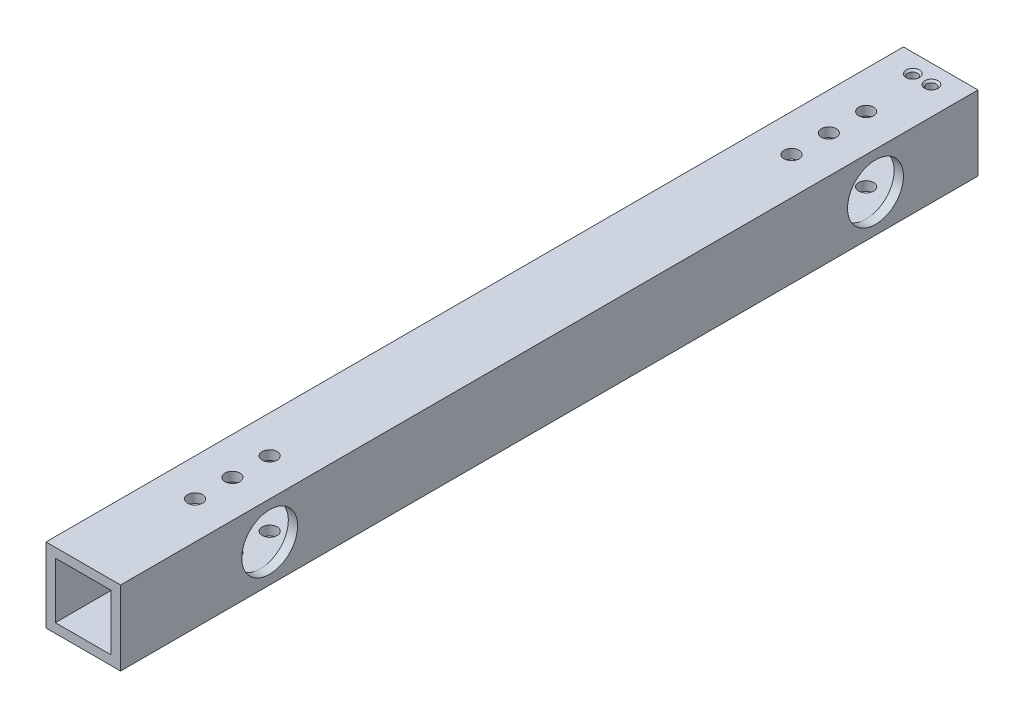
ISO-10303-21;
HEADER;
FILE_DESCRIPTION(('STEP AP214'),'2;1');
FILE_NAME('part.step','',(''),(''),'','','');
FILE_SCHEMA(('AUTOMOTIVE_DESIGN { 1 0 10303 214 1 1 1 1 }'));
ENDSEC;
DATA;
#1=APPLICATION_CONTEXT('core data for automotive mechanical design processes');
#2=APPLICATION_PROTOCOL_DEFINITION('international standard','automotive_design',2000,#1);
#3=PRODUCT_CONTEXT('',#1,'mechanical');
#4=PRODUCT('Part','Part','',(#3));
#5=PRODUCT_RELATED_PRODUCT_CATEGORY('part','',(#4));
#6=PRODUCT_DEFINITION_FORMATION('','',#4);
#7=PRODUCT_DEFINITION_CONTEXT('part definition',#1,'design');
#8=PRODUCT_DEFINITION('design','',#6,#7);
#9=PRODUCT_DEFINITION_SHAPE('','',#8);
#10=(LENGTH_UNIT() NAMED_UNIT(*) SI_UNIT(.MILLI.,.METRE.));
#11=(NAMED_UNIT(*) PLANE_ANGLE_UNIT() SI_UNIT($,.RADIAN.));
#12=(NAMED_UNIT(*) SI_UNIT($,.STERADIAN.) SOLID_ANGLE_UNIT());
#13=UNCERTAINTY_MEASURE_WITH_UNIT(LENGTH_MEASURE(1.E-05),#10,'distance_accuracy_value','');
#14=(GEOMETRIC_REPRESENTATION_CONTEXT(3) GLOBAL_UNCERTAINTY_ASSIGNED_CONTEXT((#13)) GLOBAL_UNIT_ASSIGNED_CONTEXT((#10,
#11,#12)) REPRESENTATION_CONTEXT('',''));
#15=CARTESIAN_POINT('',(0.,0.,0.));
#16=DIRECTION('',(0.,0.,1.));
#17=DIRECTION('',(1.,0.,0.));
#18=AXIS2_PLACEMENT_3D('',#15,#16,#17);
#19=CARTESIAN_POINT('',(0.,0.,292.1));
#20=DIRECTION('',(0.,1.,0.));
#21=DIRECTION('',(-1.,0.,0.));
#22=AXIS2_PLACEMENT_3D('',#19,#20,#21);
#23=PLANE('',#22);
#24=CARTESIAN_POINT('',(-9.525,0.,6.35));
#25=DIRECTION('',(0.,1.,0.));
#26=DIRECTION('',(-1.,0.,0.));
#27=AXIS2_PLACEMENT_3D('',#24,#25,#26);
#28=CIRCLE('',#27,1.63195);
#29=CARTESIAN_POINT('',(-11.15695,0.,6.35));
#30=VERTEX_POINT('',#29);
#31=EDGE_CURVE('E441',#30,#30,#28,.F.);
#32=ORIENTED_EDGE('',*,*,#31,.F.);
#33=EDGE_LOOP('',(#32));
#34=FACE_BOUND('',#33,.T.);
#35=CARTESIAN_POINT('',(-15.875,0.,6.35));
#36=DIRECTION('',(0.,1.,0.));
#37=DIRECTION('',(-1.,0.,0.));
#38=AXIS2_PLACEMENT_3D('',#35,#36,#37);
#39=CIRCLE('',#38,1.63195);
#40=CARTESIAN_POINT('',(-17.50695,0.,6.35));
#41=VERTEX_POINT('',#40);
#42=EDGE_CURVE('E424',#41,#41,#39,.F.);
#43=ORIENTED_EDGE('',*,*,#42,.F.);
#44=EDGE_LOOP('',(#43));
#45=FACE_BOUND('',#44,.T.);
#46=CARTESIAN_POINT('',(-12.7,0.,241.3));
#47=DIRECTION('',(0.,1.,0.));
#48=DIRECTION('',(-1.,0.,0.));
#49=AXIS2_PLACEMENT_3D('',#46,#47,#48);
#50=CIRCLE('',#49,2.55269999999999);
#51=CARTESIAN_POINT('',(-15.2527,0.,241.3));
#52=VERTEX_POINT('',#51);
#53=EDGE_CURVE('E170',#52,#52,#50,.F.);
#54=ORIENTED_EDGE('',*,*,#53,.F.);
#55=EDGE_LOOP('',(#54));
#56=FACE_BOUND('',#55,.T.);
#57=CARTESIAN_POINT('',(-12.7,0.,228.6));
#58=DIRECTION('',(0.,1.,0.));
#59=DIRECTION('',(-1.,0.,0.));
#60=AXIS2_PLACEMENT_3D('',#57,#58,#59);
#61=CIRCLE('',#60,2.55269999999999);
#62=CARTESIAN_POINT('',(-15.2527,0.,228.6));
#63=VERTEX_POINT('',#62);
#64=EDGE_CURVE('E367',#63,#63,#61,.F.);
#65=ORIENTED_EDGE('',*,*,#64,.F.);
#66=EDGE_LOOP('',(#65));
#67=FACE_BOUND('',#66,.T.);
#68=DIRECTION('',(1.,0.,0.));
#69=VECTOR('',#68,1.);
#70=CARTESIAN_POINT('',(0.,0.,0.));
#71=LINE('',#70,#69);
#72=CARTESIAN_POINT('',(-25.4,0.,0.));
#73=VERTEX_POINT('',#72);
#74=CARTESIAN_POINT('',(0.,0.,0.));
#75=VERTEX_POINT('',#74);
#76=EDGE_CURVE('E267',#73,#75,#71,.T.);
#77=ORIENTED_EDGE('',*,*,#76,.T.);
#78=DIRECTION('',(0.,0.,-1.));
#79=VECTOR('',#78,1.);
#80=CARTESIAN_POINT('',(0.,0.,292.1));
#81=LINE('',#80,#79);
#82=CARTESIAN_POINT('',(0.,0.,292.1));
#83=VERTEX_POINT('',#82);
#84=EDGE_CURVE('E276',#83,#75,#81,.T.);
#85=ORIENTED_EDGE('',*,*,#84,.F.);
#86=DIRECTION('',(1.,0.,0.));
#87=VECTOR('',#86,1.);
#88=CARTESIAN_POINT('',(0.,0.,292.1));
#89=LINE('',#88,#87);
#90=CARTESIAN_POINT('',(-25.4,0.,292.1));
#91=VERTEX_POINT('',#90);
#92=EDGE_CURVE('E274',#91,#83,#89,.T.);
#93=ORIENTED_EDGE('',*,*,#92,.F.);
#94=DIRECTION('',(0.,0.,-1.));
#95=VECTOR('',#94,1.);
#96=CARTESIAN_POINT('',(-25.4,0.,292.1));
#97=LINE('',#96,#95);
#98=EDGE_CURVE('E260',#91,#73,#97,.T.);
#99=ORIENTED_EDGE('',*,*,#98,.T.);
#100=EDGE_LOOP('',(#77,#85,#93,#99));
#101=FACE_BOUND('',#100,.T.);
#102=CARTESIAN_POINT('',(-12.7,0.,254.));
#103=DIRECTION('',(0.,1.,0.));
#104=DIRECTION('',(-1.,0.,0.));
#105=AXIS2_PLACEMENT_3D('',#102,#103,#104);
#106=CIRCLE('',#105,2.55269999999999);
#107=CARTESIAN_POINT('',(-15.2527,0.,254.));
#108=VERTEX_POINT('',#107);
#109=EDGE_CURVE('E186',#108,#108,#106,.F.);
#110=ORIENTED_EDGE('',*,*,#109,.F.);
#111=EDGE_LOOP('',(#110));
#112=FACE_BOUND('',#111,.T.);
#113=CARTESIAN_POINT('',(-12.7,0.,25.4));
#114=DIRECTION('',(0.,1.,0.));
#115=DIRECTION('',(-1.,0.,0.));
#116=AXIS2_PLACEMENT_3D('',#113,#114,#115);
#117=CIRCLE('',#116,2.5527);
#118=CARTESIAN_POINT('',(-15.2527,0.,25.4));
#119=VERTEX_POINT('',#118);
#120=EDGE_CURVE('E458',#119,#119,#117,.F.);
#121=ORIENTED_EDGE('',*,*,#120,.F.);
#122=EDGE_LOOP('',(#121));
#123=FACE_BOUND('',#122,.T.);
#124=CARTESIAN_POINT('',(-12.7,0.,38.1));
#125=DIRECTION('',(0.,1.,0.));
#126=DIRECTION('',(-1.,0.,0.));
#127=AXIS2_PLACEMENT_3D('',#124,#125,#126);
#128=CIRCLE('',#127,2.5527);
#129=CARTESIAN_POINT('',(-15.2527,0.,38.1));
#130=VERTEX_POINT('',#129);
#131=EDGE_CURVE('E470',#130,#130,#128,.F.);
#132=ORIENTED_EDGE('',*,*,#131,.F.);
#133=EDGE_LOOP('',(#132));
#134=FACE_BOUND('',#133,.T.);
#135=CARTESIAN_POINT('',(-12.7,0.,50.8));
#136=DIRECTION('',(0.,1.,0.));
#137=DIRECTION('',(-1.,0.,0.));
#138=AXIS2_PLACEMENT_3D('',#135,#136,#137);
#139=CIRCLE('',#138,2.5527);
#140=CARTESIAN_POINT('',(-15.2527,0.,50.8));
#141=VERTEX_POINT('',#140);
#142=EDGE_CURVE('E482',#141,#141,#139,.F.);
#143=ORIENTED_EDGE('',*,*,#142,.F.);
#144=EDGE_LOOP('',(#143));
#145=FACE_BOUND('',#144,.T.);
#146=ADVANCED_FACE('F38',(#34,#45,#56,#67,#101,#112,#123,#134,#145),#23,.F.);
#147=CARTESIAN_POINT('',(0.,25.4,292.1));
#148=DIRECTION('',(0.,-1.,0.));
#149=DIRECTION('',(1.,0.,0.));
#150=AXIS2_PLACEMENT_3D('',#147,#148,#149);
#151=PLANE('',#150);
#152=CARTESIAN_POINT('',(-12.7,25.4,50.8));
#153=DIRECTION('',(0.,1.,0.));
#154=DIRECTION('',(0.,0.,1.));
#155=AXIS2_PLACEMENT_3D('',#152,#153,#154);
#156=CIRCLE('',#155,2.5527);
#157=CARTESIAN_POINT('',(-12.7,25.4,53.3527));
#158=VERTEX_POINT('',#157);
#159=EDGE_CURVE('E483',#158,#158,#156,.T.);
#160=ORIENTED_EDGE('',*,*,#159,.F.);
#161=EDGE_LOOP('',(#160));
#162=FACE_BOUND('',#161,.T.);
#163=CARTESIAN_POINT('',(-12.7,25.4,25.4));
#164=DIRECTION('',(0.,1.,0.));
#165=DIRECTION('',(0.,0.,1.));
#166=AXIS2_PLACEMENT_3D('',#163,#164,#165);
#167=CIRCLE('',#166,2.5527);
#168=CARTESIAN_POINT('',(-12.7,25.4,27.9527));
#169=VERTEX_POINT('',#168);
#170=EDGE_CURVE('E454',#169,#169,#167,.T.);
#171=ORIENTED_EDGE('',*,*,#170,.F.);
#172=EDGE_LOOP('',(#171));
#173=FACE_BOUND('',#172,.T.);
#174=CARTESIAN_POINT('',(-9.525,25.4,6.35));
#175=DIRECTION('',(0.,1.,0.));
#176=DIRECTION('',(0.,0.,1.));
#177=AXIS2_PLACEMENT_3D('',#174,#175,#176);
#178=CIRCLE('',#177,2.26695);
#179=CARTESIAN_POINT('',(-9.525,25.4,8.61695));
#180=VERTEX_POINT('',#179);
#181=EDGE_CURVE('E442',#180,#180,#178,.T.);
#182=ORIENTED_EDGE('',*,*,#181,.F.);
#183=EDGE_LOOP('',(#182));
#184=FACE_BOUND('',#183,.T.);
#185=CARTESIAN_POINT('',(-15.875,25.4,6.35));
#186=DIRECTION('',(0.,1.,0.));
#187=DIRECTION('',(0.,0.,1.));
#188=AXIS2_PLACEMENT_3D('',#185,#186,#187);
#189=CIRCLE('',#188,2.26695);
#190=CARTESIAN_POINT('',(-15.875,25.4,8.61695));
#191=VERTEX_POINT('',#190);
#192=EDGE_CURVE('E425',#191,#191,#189,.T.);
#193=ORIENTED_EDGE('',*,*,#192,.F.);
#194=EDGE_LOOP('',(#193));
#195=FACE_BOUND('',#194,.T.);
#196=CARTESIAN_POINT('',(-12.7,25.4,254.));
#197=DIRECTION('',(0.,1.,0.));
#198=DIRECTION('',(0.,0.,1.));
#199=AXIS2_PLACEMENT_3D('',#196,#197,#198);
#200=CIRCLE('',#199,2.55269999999999);
#201=CARTESIAN_POINT('',(-12.7,25.4,256.5527));
#202=VERTEX_POINT('',#201);
#203=EDGE_CURVE('E380',#202,#202,#200,.T.);
#204=ORIENTED_EDGE('',*,*,#203,.F.);
#205=EDGE_LOOP('',(#204));
#206=FACE_BOUND('',#205,.T.);
#207=CARTESIAN_POINT('',(-12.7,25.4,241.3));
#208=DIRECTION('',(0.,1.,0.));
#209=DIRECTION('',(0.,0.,1.));
#210=AXIS2_PLACEMENT_3D('',#207,#208,#209);
#211=CIRCLE('',#210,2.55269999999999);
#212=CARTESIAN_POINT('',(-12.7,25.4,243.8527));
#213=VERTEX_POINT('',#212);
#214=EDGE_CURVE('E176',#213,#213,#211,.T.);
#215=ORIENTED_EDGE('',*,*,#214,.F.);
#216=EDGE_LOOP('',(#215));
#217=FACE_BOUND('',#216,.T.);
#218=CARTESIAN_POINT('',(-12.7,25.4,228.6));
#219=DIRECTION('',(0.,1.,0.));
#220=DIRECTION('',(0.,0.,1.));
#221=AXIS2_PLACEMENT_3D('',#218,#219,#220);
#222=CIRCLE('',#221,2.55269999999999);
#223=CARTESIAN_POINT('',(-12.7,25.4,231.1527));
#224=VERTEX_POINT('',#223);
#225=EDGE_CURVE('E363',#224,#224,#222,.T.);
#226=ORIENTED_EDGE('',*,*,#225,.F.);
#227=EDGE_LOOP('',(#226));
#228=FACE_BOUND('',#227,.T.);
#229=DIRECTION('',(-1.,0.,0.));
#230=VECTOR('',#229,1.);
#231=CARTESIAN_POINT('',(0.,25.4,0.));
#232=LINE('',#231,#230);
#233=CARTESIAN_POINT('',(0.,25.4,0.));
#234=VERTEX_POINT('',#233);
#235=CARTESIAN_POINT('',(-25.4,25.4,0.));
#236=VERTEX_POINT('',#235);
#237=EDGE_CURVE('E268',#234,#236,#232,.T.);
#238=ORIENTED_EDGE('',*,*,#237,.T.);
#239=DIRECTION('',(0.,0.,-1.));
#240=VECTOR('',#239,1.);
#241=CARTESIAN_POINT('',(-25.4,25.4,292.1));
#242=LINE('',#241,#240);
#243=CARTESIAN_POINT('',(-25.4,25.4,292.1));
#244=VERTEX_POINT('',#243);
#245=EDGE_CURVE('E263',#244,#236,#242,.T.);
#246=ORIENTED_EDGE('',*,*,#245,.F.);
#247=DIRECTION('',(-1.,0.,0.));
#248=VECTOR('',#247,1.);
#249=CARTESIAN_POINT('',(0.,25.4,292.1));
#250=LINE('',#249,#248);
#251=CARTESIAN_POINT('',(0.,25.4,292.1));
#252=VERTEX_POINT('',#251);
#253=EDGE_CURVE('E287',#252,#244,#250,.T.);
#254=ORIENTED_EDGE('',*,*,#253,.F.);
#255=DIRECTION('',(0.,0.,-1.));
#256=VECTOR('',#255,1.);
#257=CARTESIAN_POINT('',(0.,25.4,292.1));
#258=LINE('',#257,#256);
#259=EDGE_CURVE('E153',#252,#234,#258,.T.);
#260=ORIENTED_EDGE('',*,*,#259,.T.);
#261=EDGE_LOOP('',(#238,#246,#254,#260));
#262=FACE_BOUND('',#261,.T.);
#263=CARTESIAN_POINT('',(-12.7,25.4,38.1));
#264=DIRECTION('',(0.,1.,0.));
#265=DIRECTION('',(0.,0.,1.));
#266=AXIS2_PLACEMENT_3D('',#263,#264,#265);
#267=CIRCLE('',#266,2.5527);
#268=CARTESIAN_POINT('',(-12.7,25.4,40.6527));
#269=VERTEX_POINT('',#268);
#270=EDGE_CURVE('E466',#269,#269,#267,.T.);
#271=ORIENTED_EDGE('',*,*,#270,.F.);
#272=EDGE_LOOP('',(#271));
#273=FACE_BOUND('',#272,.T.);
#274=ADVANCED_FACE('F219',(#162,#173,#184,#195,#206,#217,#228,#262,#273),#151,.F.);
#275=CARTESIAN_POINT('',(-3.175,22.225,292.1));
#276=DIRECTION('',(0.,-1.,0.));
#277=DIRECTION('',(1.,0.,0.));
#278=AXIS2_PLACEMENT_3D('',#275,#276,#277);
#279=PLANE('',#278);
#280=DIRECTION('',(-1.,0.,0.));
#281=VECTOR('',#280,1.);
#282=CARTESIAN_POINT('',(26.9407683632075,22.225,241.758543123959));
#283=LINE('',#282,#281);
#284=CARTESIAN_POINT('',(-3.175,22.225,241.758543123959));
#285=VERTEX_POINT('',#284);
#286=CARTESIAN_POINT('',(-10.1888218913287,22.225,241.758543123959));
#287=VERTEX_POINT('',#286);
#288=EDGE_CURVE('E147',#285,#287,#283,.T.);
#289=ORIENTED_EDGE('',*,*,#288,.F.);
#290=DIRECTION('',(0.,0.,-1.));
#291=VECTOR('',#290,1.);
#292=CARTESIAN_POINT('',(-3.175,22.225,292.1));
#293=LINE('',#292,#291);
#294=CARTESIAN_POINT('',(-3.175,22.225,292.1));
#295=VERTEX_POINT('',#294);
#296=EDGE_CURVE('E302',#295,#285,#293,.T.);
#297=ORIENTED_EDGE('',*,*,#296,.F.);
#298=DIRECTION('',(-1.,0.,0.));
#299=VECTOR('',#298,1.);
#300=CARTESIAN_POINT('',(-3.175,22.225,292.1));
#301=LINE('',#300,#299);
#302=CARTESIAN_POINT('',(-22.225,22.225,292.1));
#303=VERTEX_POINT('',#302);
#304=EDGE_CURVE('E355',#295,#303,#301,.T.);
#305=ORIENTED_EDGE('',*,*,#304,.T.);
#306=DIRECTION('',(0.,0.,-1.));
#307=VECTOR('',#306,1.);
#308=CARTESIAN_POINT('',(-22.225,22.225,292.1));
#309=LINE('',#308,#307);
#310=CARTESIAN_POINT('',(-22.225,22.225,241.758543123959));
#311=VERTEX_POINT('',#310);
#312=EDGE_CURVE('E317',#303,#311,#309,.T.);
#313=ORIENTED_EDGE('',*,*,#312,.T.);
#314=CARTESIAN_POINT('',(-15.2111781086713,22.225,241.758543123959));
#315=VERTEX_POINT('',#314);
#316=EDGE_CURVE('E402',#315,#311,#283,.T.);
#317=ORIENTED_EDGE('',*,*,#316,.F.);
#318=CARTESIAN_POINT('',(-12.7,22.225,241.3));
#319=DIRECTION('',(0.,-1.,0.));
#320=DIRECTION('',(1.,0.,0.));
#321=AXIS2_PLACEMENT_3D('',#318,#319,#320);
#322=CIRCLE('',#321,2.55269999999999);
#323=EDGE_CURVE('E169',#287,#315,#322,.T.);
#324=ORIENTED_EDGE('',*,*,#323,.F.);
#325=EDGE_LOOP('',(#289,#297,#305,#313,#317,#324));
#326=FACE_BOUND('',#325,.T.);
#327=CARTESIAN_POINT('',(-12.7,22.225,254.));
#328=DIRECTION('',(0.,-1.,0.));
#329=DIRECTION('',(1.,0.,0.));
#330=AXIS2_PLACEMENT_3D('',#327,#328,#329);
#331=CIRCLE('',#330,2.55269999999999);
#332=CARTESIAN_POINT('',(-10.1473,22.225,254.));
#333=VERTEX_POINT('',#332);
#334=EDGE_CURVE('E185',#333,#333,#331,.T.);
#335=ORIENTED_EDGE('',*,*,#334,.F.);
#336=EDGE_LOOP('',(#335));
#337=FACE_BOUND('',#336,.T.);
#338=ADVANCED_FACE('F226',(#326,#337),#279,.T.);
#339=CARTESIAN_POINT('',(-12.7,22.225,50.8));
#340=DIRECTION('',(0.,-1.,0.));
#341=DIRECTION('',(1.,0.,0.));
#342=AXIS2_PLACEMENT_3D('',#339,#340,#341);
#343=CIRCLE('',#342,2.5527);
#344=CARTESIAN_POINT('',(-10.1473,22.225,50.8));
#345=VERTEX_POINT('',#344);
#346=EDGE_CURVE('E478',#345,#345,#343,.T.);
#347=ORIENTED_EDGE('',*,*,#346,.F.);
#348=EDGE_LOOP('',(#347));
#349=FACE_BOUND('',#348,.T.);
#350=CARTESIAN_POINT('',(-12.7,22.225,38.1));
#351=DIRECTION('',(0.,-1.,0.));
#352=DIRECTION('',(1.,0.,0.));
#353=AXIS2_PLACEMENT_3D('',#350,#351,#352);
#354=CIRCLE('',#353,2.5527);
#355=CARTESIAN_POINT('',(-10.1473,22.225,38.1));
#356=VERTEX_POINT('',#355);
#357=EDGE_CURVE('E459',#356,#356,#354,.T.);
#358=ORIENTED_EDGE('',*,*,#357,.F.);
#359=EDGE_LOOP('',(#358));
#360=FACE_BOUND('',#359,.T.);
#361=DIRECTION('',(-1.,0.,0.));
#362=VECTOR('',#361,1.);
#363=CARTESIAN_POINT('',(26.9407683632075,22.225,240.841456876041));
#364=LINE('',#363,#362);
#365=CARTESIAN_POINT('',(-22.225,22.225,240.841456876041));
#366=VERTEX_POINT('',#365);
#367=CARTESIAN_POINT('',(-15.2111781086713,22.225,240.841456876041));
#368=VERTEX_POINT('',#367);
#369=EDGE_CURVE('E63',#366,#368,#364,.F.);
#370=ORIENTED_EDGE('',*,*,#369,.F.);
#371=CARTESIAN_POINT('',(-22.225,22.225,35.3835431239589));
#372=VERTEX_POINT('',#371);
#373=EDGE_CURVE('E321',#366,#372,#309,.T.);
#374=ORIENTED_EDGE('',*,*,#373,.T.);
#375=DIRECTION('',(-1.,0.,0.));
#376=VECTOR('',#375,1.);
#377=CARTESIAN_POINT('',(26.9407683632075,22.225,35.3835431239587));
#378=LINE('',#377,#376);
#379=CARTESIAN_POINT('',(-3.175,22.225,35.3835431239587));
#380=VERTEX_POINT('',#379);
#381=EDGE_CURVE('E55',#380,#372,#378,.T.);
#382=ORIENTED_EDGE('',*,*,#381,.F.);
#383=CARTESIAN_POINT('',(-3.175,22.225,240.841456876041));
#384=VERTEX_POINT('',#383);
#385=EDGE_CURVE('E162',#384,#380,#293,.T.);
#386=ORIENTED_EDGE('',*,*,#385,.F.);
#387=CARTESIAN_POINT('',(-10.1888218913287,22.225,240.841456876041));
#388=VERTEX_POINT('',#387);
#389=EDGE_CURVE('E144',#388,#384,#364,.F.);
#390=ORIENTED_EDGE('',*,*,#389,.F.);
#391=EDGE_CURVE('E160',#368,#388,#322,.T.);
#392=ORIENTED_EDGE('',*,*,#391,.F.);
#393=EDGE_LOOP('',(#370,#374,#382,#386,#390,#392));
#394=FACE_BOUND('',#393,.T.);
#395=CARTESIAN_POINT('',(-12.7,22.225,228.6));
#396=DIRECTION('',(0.,-1.,0.));
#397=DIRECTION('',(1.,0.,0.));
#398=AXIS2_PLACEMENT_3D('',#395,#396,#397);
#399=CIRCLE('',#398,2.55269999999999);
#400=CARTESIAN_POINT('',(-10.1473,22.225,228.6));
#401=VERTEX_POINT('',#400);
#402=EDGE_CURVE('E348',#401,#401,#399,.T.);
#403=ORIENTED_EDGE('',*,*,#402,.F.);
#404=EDGE_LOOP('',(#403));
#405=FACE_BOUND('',#404,.T.);
#406=ADVANCED_FACE('F158',(#349,#360,#394,#405),#279,.T.);
#407=CARTESIAN_POINT('',(0.,0.,292.1));
#408=DIRECTION('',(0.,0.,1.));
#409=DIRECTION('',(1.,0.,0.));
#410=AXIS2_PLACEMENT_3D('',#407,#408,#409);
#411=PLANE('',#410);
#412=DIRECTION('',(0.,1.,0.));
#413=VECTOR('',#412,1.);
#414=CARTESIAN_POINT('',(0.,0.,292.1));
#415=LINE('',#414,#413);
#416=EDGE_CURVE('E283',#83,#252,#415,.T.);
#417=ORIENTED_EDGE('',*,*,#416,.T.);
#418=ORIENTED_EDGE('',*,*,#253,.T.);
#419=DIRECTION('',(0.,-1.,0.));
#420=VECTOR('',#419,1.);
#421=CARTESIAN_POINT('',(-25.4,0.,292.1));
#422=LINE('',#421,#420);
#423=EDGE_CURVE('E312',#244,#91,#422,.T.);
#424=ORIENTED_EDGE('',*,*,#423,.T.);
#425=ORIENTED_EDGE('',*,*,#92,.T.);
#426=EDGE_LOOP('',(#417,#418,#424,#425));
#427=FACE_BOUND('',#426,.T.);
#428=ORIENTED_EDGE('',*,*,#304,.F.);
#429=DIRECTION('',(0.,1.,0.));
#430=VECTOR('',#429,1.);
#431=CARTESIAN_POINT('',(-3.175,3.175,292.1));
#432=LINE('',#431,#430);
#433=CARTESIAN_POINT('',(-3.175,3.175,292.1));
#434=VERTEX_POINT('',#433);
#435=EDGE_CURVE('E335',#434,#295,#432,.T.);
#436=ORIENTED_EDGE('',*,*,#435,.F.);
#437=DIRECTION('',(1.,0.,0.));
#438=VECTOR('',#437,1.);
#439=CARTESIAN_POINT('',(-3.175,3.175,292.1));
#440=LINE('',#439,#438);
#441=CARTESIAN_POINT('',(-22.225,3.175,292.1));
#442=VERTEX_POINT('',#441);
#443=EDGE_CURVE('E330',#442,#434,#440,.T.);
#444=ORIENTED_EDGE('',*,*,#443,.F.);
#445=DIRECTION('',(0.,-1.,0.));
#446=VECTOR('',#445,1.);
#447=CARTESIAN_POINT('',(-22.225,3.175,292.1));
#448=LINE('',#447,#446);
#449=EDGE_CURVE('E351',#303,#442,#448,.T.);
#450=ORIENTED_EDGE('',*,*,#449,.F.);
#451=EDGE_LOOP('',(#428,#436,#444,#450));
#452=FACE_BOUND('',#451,.T.);
#453=ADVANCED_FACE('F559',(#427,#452),#411,.T.);
#454=CARTESIAN_POINT('',(0.,0.,0.));
#455=DIRECTION('',(0.,0.,1.));
#456=DIRECTION('',(1.,0.,0.));
#457=AXIS2_PLACEMENT_3D('',#454,#455,#456);
#458=PLANE('',#457);
#459=DIRECTION('',(0.,1.,0.));
#460=VECTOR('',#459,1.);
#461=CARTESIAN_POINT('',(0.,0.,0.));
#462=LINE('',#461,#460);
#463=EDGE_CURVE('E281',#75,#234,#462,.T.);
#464=ORIENTED_EDGE('',*,*,#463,.F.);
#465=ORIENTED_EDGE('',*,*,#76,.F.);
#466=DIRECTION('',(0.,-1.,0.));
#467=VECTOR('',#466,1.);
#468=CARTESIAN_POINT('',(-25.4,0.,0.));
#469=LINE('',#468,#467);
#470=EDGE_CURVE('E257',#236,#73,#469,.T.);
#471=ORIENTED_EDGE('',*,*,#470,.F.);
#472=ORIENTED_EDGE('',*,*,#237,.F.);
#473=EDGE_LOOP('',(#464,#465,#471,#472));
#474=FACE_BOUND('',#473,.T.);
#475=DIRECTION('',(0.,1.,0.));
#476=VECTOR('',#475,1.);
#477=CARTESIAN_POINT('',(-3.175,3.175,0.));
#478=LINE('',#477,#476);
#479=CARTESIAN_POINT('',(-3.175,3.175,0.));
#480=VERTEX_POINT('',#479);
#481=CARTESIAN_POINT('',(-3.175,22.225,0.));
#482=VERTEX_POINT('',#481);
#483=EDGE_CURVE('E344',#480,#482,#478,.T.);
#484=ORIENTED_EDGE('',*,*,#483,.T.);
#485=DIRECTION('',(-1.,0.,0.));
#486=VECTOR('',#485,1.);
#487=CARTESIAN_POINT('',(-3.175,22.225,0.));
#488=LINE('',#487,#486);
#489=CARTESIAN_POINT('',(-22.225,22.225,0.));
#490=VERTEX_POINT('',#489);
#491=EDGE_CURVE('E340',#482,#490,#488,.T.);
#492=ORIENTED_EDGE('',*,*,#491,.T.);
#493=DIRECTION('',(0.,-1.,0.));
#494=VECTOR('',#493,1.);
#495=CARTESIAN_POINT('',(-22.225,3.175,0.));
#496=LINE('',#495,#494);
#497=CARTESIAN_POINT('',(-22.225,3.175,0.));
#498=VERTEX_POINT('',#497);
#499=EDGE_CURVE('E336',#490,#498,#496,.T.);
#500=ORIENTED_EDGE('',*,*,#499,.T.);
#501=DIRECTION('',(1.,0.,0.));
#502=VECTOR('',#501,1.);
#503=CARTESIAN_POINT('',(-3.175,3.175,0.));
#504=LINE('',#503,#502);
#505=EDGE_CURVE('E331',#498,#480,#504,.T.);
#506=ORIENTED_EDGE('',*,*,#505,.T.);
#507=EDGE_LOOP('',(#484,#492,#500,#506));
#508=FACE_BOUND('',#507,.T.);
#509=ADVANCED_FACE('F232',(#474,#508),#458,.F.);
#510=CARTESIAN_POINT('',(0.,0.,292.1));
#511=DIRECTION('',(-1.,0.,0.));
#512=DIRECTION('',(0.,-1.,0.));
#513=AXIS2_PLACEMENT_3D('',#510,#511,#512);
#514=PLANE('',#513);
#515=CARTESIAN_POINT('',(0.,12.7110437669984,241.3));
#516=DIRECTION('',(-1.,0.,0.));
#517=DIRECTION('',(0.,-1.,0.));
#518=AXIS2_PLACEMENT_3D('',#515,#516,#517);
#519=CIRCLE('',#518,9.52500000000002);
#520=CARTESIAN_POINT('',(0.,3.18604376699837,241.3));
#521=VERTEX_POINT('',#520);
#522=EDGE_CURVE('E164',#521,#521,#519,.F.);
#523=ORIENTED_EDGE('',*,*,#522,.F.);
#524=EDGE_LOOP('',(#523));
#525=FACE_BOUND('',#524,.T.);
#526=CARTESIAN_POINT('',(0.,12.7110437669984,34.925));
#527=DIRECTION('',(-1.,0.,0.));
#528=DIRECTION('',(0.,-1.,0.));
#529=AXIS2_PLACEMENT_3D('',#526,#527,#528);
#530=CIRCLE('',#529,9.52500000000001);
#531=CARTESIAN_POINT('',(0.,3.18604376699838,34.925));
#532=VERTEX_POINT('',#531);
#533=EDGE_CURVE('E408',#532,#532,#530,.F.);
#534=ORIENTED_EDGE('',*,*,#533,.F.);
#535=EDGE_LOOP('',(#534));
#536=FACE_BOUND('',#535,.T.);
#537=ORIENTED_EDGE('',*,*,#463,.T.);
#538=ORIENTED_EDGE('',*,*,#259,.F.);
#539=ORIENTED_EDGE('',*,*,#416,.F.);
#540=ORIENTED_EDGE('',*,*,#84,.T.);
#541=EDGE_LOOP('',(#537,#538,#539,#540));
#542=FACE_BOUND('',#541,.T.);
#543=ADVANCED_FACE('F40',(#525,#536,#542),#514,.F.);
#544=CARTESIAN_POINT('',(-25.4,0.,292.1));
#545=DIRECTION('',(1.,0.,0.));
#546=DIRECTION('',(0.,0.,-1.));
#547=AXIS2_PLACEMENT_3D('',#544,#545,#546);
#548=PLANE('',#547);
#549=CARTESIAN_POINT('',(-25.4,12.7110437669984,241.3));
#550=DIRECTION('',(1.,0.,0.));
#551=DIRECTION('',(0.,0.,-1.));
#552=AXIS2_PLACEMENT_3D('',#549,#550,#551);
#553=CIRCLE('',#552,9.52500000000002);
#554=CARTESIAN_POINT('',(-25.4,12.7110437669984,231.775));
#555=VERTEX_POINT('',#554);
#556=EDGE_CURVE('E249',#555,#555,#553,.T.);
#557=ORIENTED_EDGE('',*,*,#556,.T.);
#558=EDGE_LOOP('',(#557));
#559=FACE_BOUND('',#558,.T.);
#560=CARTESIAN_POINT('',(-25.4,12.7110437669984,34.925));
#561=DIRECTION('',(1.,0.,0.));
#562=DIRECTION('',(0.,0.,-1.));
#563=AXIS2_PLACEMENT_3D('',#560,#561,#562);
#564=CIRCLE('',#563,9.52500000000001);
#565=CARTESIAN_POINT('',(-25.4,12.7110437669984,25.4));
#566=VERTEX_POINT('',#565);
#567=EDGE_CURVE('E253',#566,#566,#564,.T.);
#568=ORIENTED_EDGE('',*,*,#567,.T.);
#569=EDGE_LOOP('',(#568));
#570=FACE_BOUND('',#569,.T.);
#571=ORIENTED_EDGE('',*,*,#470,.T.);
#572=ORIENTED_EDGE('',*,*,#98,.F.);
#573=ORIENTED_EDGE('',*,*,#423,.F.);
#574=ORIENTED_EDGE('',*,*,#245,.T.);
#575=EDGE_LOOP('',(#571,#572,#573,#574));
#576=FACE_BOUND('',#575,.T.);
#577=ADVANCED_FACE('F234',(#559,#570,#576),#548,.F.);
#578=CARTESIAN_POINT('',(-3.175,3.175,292.1));
#579=DIRECTION('',(-1.,0.,0.));
#580=DIRECTION('',(0.,0.,1.));
#581=AXIS2_PLACEMENT_3D('',#578,#579,#580);
#582=PLANE('',#581);
#583=CARTESIAN_POINT('',(-3.175,12.7110437669984,241.3));
#584=DIRECTION('',(-1.,0.,0.));
#585=DIRECTION('',(0.,0.,1.));
#586=AXIS2_PLACEMENT_3D('',#583,#584,#585);
#587=CIRCLE('',#586,9.52500000000002);
#588=EDGE_CURVE('E403',#384,#285,#587,.T.);
#589=ORIENTED_EDGE('',*,*,#588,.F.);
#590=ORIENTED_EDGE('',*,*,#385,.T.);
#591=CARTESIAN_POINT('',(-3.175,12.7110437669984,34.925));
#592=DIRECTION('',(-1.,0.,0.));
#593=DIRECTION('',(0.,0.,1.));
#594=AXIS2_PLACEMENT_3D('',#591,#592,#593);
#595=CIRCLE('',#594,9.52500000000001);
#596=CARTESIAN_POINT('',(-3.175,22.225,34.4664568760413));
#597=VERTEX_POINT('',#596);
#598=EDGE_CURVE('E389',#597,#380,#595,.T.);
#599=ORIENTED_EDGE('',*,*,#598,.F.);
#600=EDGE_CURVE('E308',#597,#482,#293,.T.);
#601=ORIENTED_EDGE('',*,*,#600,.T.);
#602=ORIENTED_EDGE('',*,*,#483,.F.);
#603=DIRECTION('',(0.,0.,-1.));
#604=VECTOR('',#603,1.);
#605=CARTESIAN_POINT('',(-3.175,3.175,292.1));
#606=LINE('',#605,#604);
#607=EDGE_CURVE('E326',#434,#480,#606,.T.);
#608=ORIENTED_EDGE('',*,*,#607,.F.);
#609=ORIENTED_EDGE('',*,*,#435,.T.);
#610=ORIENTED_EDGE('',*,*,#296,.T.);
#611=EDGE_LOOP('',(#589,#590,#599,#601,#602,#608,#609,#610));
#612=FACE_BOUND('',#611,.T.);
#613=ADVANCED_FACE('F236',(#612),#582,.T.);
#614=CARTESIAN_POINT('',(-12.7,22.225,25.4));
#615=DIRECTION('',(0.,-1.,0.));
#616=DIRECTION('',(1.,0.,0.));
#617=AXIS2_PLACEMENT_3D('',#614,#615,#616);
#618=CIRCLE('',#617,2.5527);
#619=CARTESIAN_POINT('',(-10.1473,22.225,25.4));
#620=VERTEX_POINT('',#619);
#621=EDGE_CURVE('E446',#620,#620,#618,.T.);
#622=ORIENTED_EDGE('',*,*,#621,.F.);
#623=EDGE_LOOP('',(#622));
#624=FACE_BOUND('',#623,.T.);
#625=CARTESIAN_POINT('',(-9.525,22.225,6.35));
#626=DIRECTION('',(0.,-1.,0.));
#627=DIRECTION('',(1.,0.,0.));
#628=AXIS2_PLACEMENT_3D('',#625,#626,#627);
#629=CIRCLE('',#628,1.63195);
#630=CARTESIAN_POINT('',(-7.89305,22.225,6.35));
#631=VERTEX_POINT('',#630);
#632=EDGE_CURVE('E429',#631,#631,#629,.T.);
#633=ORIENTED_EDGE('',*,*,#632,.F.);
#634=EDGE_LOOP('',(#633));
#635=FACE_BOUND('',#634,.T.);
#636=CARTESIAN_POINT('',(-15.875,22.225,6.35));
#637=DIRECTION('',(0.,-1.,0.));
#638=DIRECTION('',(1.,0.,0.));
#639=AXIS2_PLACEMENT_3D('',#636,#637,#638);
#640=CIRCLE('',#639,1.63195);
#641=CARTESIAN_POINT('',(-14.24305,22.225,6.35));
#642=VERTEX_POINT('',#641);
#643=EDGE_CURVE('E412',#642,#642,#640,.T.);
#644=ORIENTED_EDGE('',*,*,#643,.F.);
#645=EDGE_LOOP('',(#644));
#646=FACE_BOUND('',#645,.T.);
#647=DIRECTION('',(-1.,0.,0.));
#648=VECTOR('',#647,1.);
#649=CARTESIAN_POINT('',(26.9407683632075,22.225,34.4664568760413));
#650=LINE('',#649,#648);
#651=CARTESIAN_POINT('',(-22.225,22.225,34.4664568760411));
#652=VERTEX_POINT('',#651);
#653=EDGE_CURVE('E394',#652,#597,#650,.F.);
#654=ORIENTED_EDGE('',*,*,#653,.F.);
#655=EDGE_CURVE('E322',#652,#490,#309,.T.);
#656=ORIENTED_EDGE('',*,*,#655,.T.);
#657=ORIENTED_EDGE('',*,*,#491,.F.);
#658=ORIENTED_EDGE('',*,*,#600,.F.);
#659=EDGE_LOOP('',(#654,#656,#657,#658));
#660=FACE_BOUND('',#659,.T.);
#661=ADVANCED_FACE('F242',(#624,#635,#646,#660),#279,.T.);
#662=CARTESIAN_POINT('',(-22.225,3.175,292.1));
#663=DIRECTION('',(1.,0.,0.));
#664=DIRECTION('',(0.,0.,-1.));
#665=AXIS2_PLACEMENT_3D('',#662,#663,#664);
#666=PLANE('',#665);
#667=CARTESIAN_POINT('',(-22.225,12.7110437669984,241.3));
#668=DIRECTION('',(1.,0.,0.));
#669=DIRECTION('',(0.,0.,-1.));
#670=AXIS2_PLACEMENT_3D('',#667,#668,#669);
#671=CIRCLE('',#670,9.52500000000002);
#672=EDGE_CURVE('E399',#311,#366,#671,.T.);
#673=ORIENTED_EDGE('',*,*,#672,.F.);
#674=ORIENTED_EDGE('',*,*,#312,.F.);
#675=ORIENTED_EDGE('',*,*,#449,.T.);
#676=DIRECTION('',(0.,0.,-1.));
#677=VECTOR('',#676,1.);
#678=CARTESIAN_POINT('',(-22.225,3.175,292.1));
#679=LINE('',#678,#677);
#680=EDGE_CURVE('E323',#442,#498,#679,.T.);
#681=ORIENTED_EDGE('',*,*,#680,.T.);
#682=ORIENTED_EDGE('',*,*,#499,.F.);
#683=ORIENTED_EDGE('',*,*,#655,.F.);
#684=CARTESIAN_POINT('',(-22.225,12.7110437669984,34.925));
#685=DIRECTION('',(1.,0.,0.));
#686=DIRECTION('',(0.,0.,-1.));
#687=AXIS2_PLACEMENT_3D('',#684,#685,#686);
#688=CIRCLE('',#687,9.52500000000001);
#689=EDGE_CURVE('E11',#372,#652,#688,.T.);
#690=ORIENTED_EDGE('',*,*,#689,.F.);
#691=ORIENTED_EDGE('',*,*,#373,.F.);
#692=EDGE_LOOP('',(#673,#674,#675,#681,#682,#683,#690,#691));
#693=FACE_BOUND('',#692,.T.);
#694=ADVANCED_FACE('F552',(#693),#666,.T.);
#695=CARTESIAN_POINT('',(-3.175,3.175,292.1));
#696=DIRECTION('',(0.,1.,0.));
#697=DIRECTION('',(-1.,0.,0.));
#698=AXIS2_PLACEMENT_3D('',#695,#696,#697);
#699=PLANE('',#698);
#700=CARTESIAN_POINT('',(-12.7,3.175,50.8));
#701=DIRECTION('',(0.,1.,0.));
#702=DIRECTION('',(-1.,0.,0.));
#703=AXIS2_PLACEMENT_3D('',#700,#701,#702);
#704=CIRCLE('',#703,2.5527);
#705=CARTESIAN_POINT('',(-15.2527,3.175,50.8));
#706=VERTEX_POINT('',#705);
#707=EDGE_CURVE('E471',#706,#706,#704,.T.);
#708=ORIENTED_EDGE('',*,*,#707,.F.);
#709=EDGE_LOOP('',(#708));
#710=FACE_BOUND('',#709,.T.);
#711=CARTESIAN_POINT('',(-12.7,3.175,38.1));
#712=DIRECTION('',(0.,1.,0.));
#713=DIRECTION('',(-1.,0.,0.));
#714=AXIS2_PLACEMENT_3D('',#711,#712,#713);
#715=CIRCLE('',#714,2.5527);
#716=CARTESIAN_POINT('',(-15.2527,3.175,38.1));
#717=VERTEX_POINT('',#716);
#718=EDGE_CURVE('E42',#717,#717,#715,.T.);
#719=ORIENTED_EDGE('',*,*,#718,.F.);
#720=EDGE_LOOP('',(#719));
#721=FACE_BOUND('',#720,.T.);
#722=CARTESIAN_POINT('',(-12.7,3.175,25.4));
#723=DIRECTION('',(0.,1.,0.));
#724=DIRECTION('',(-1.,0.,0.));
#725=AXIS2_PLACEMENT_3D('',#722,#723,#724);
#726=CIRCLE('',#725,2.5527);
#727=CARTESIAN_POINT('',(-15.2527,3.175,25.4));
#728=VERTEX_POINT('',#727);
#729=EDGE_CURVE('E453',#728,#728,#726,.T.);
#730=ORIENTED_EDGE('',*,*,#729,.F.);
#731=EDGE_LOOP('',(#730));
#732=FACE_BOUND('',#731,.T.);
#733=CARTESIAN_POINT('',(-9.525,3.175,6.35));
#734=DIRECTION('',(0.,1.,0.));
#735=DIRECTION('',(-1.,0.,0.));
#736=AXIS2_PLACEMENT_3D('',#733,#734,#735);
#737=CIRCLE('',#736,1.63195);
#738=CARTESIAN_POINT('',(-11.15695,3.175,6.35));
#739=VERTEX_POINT('',#738);
#740=EDGE_CURVE('E436',#739,#739,#737,.T.);
#741=ORIENTED_EDGE('',*,*,#740,.F.);
#742=EDGE_LOOP('',(#741));
#743=FACE_BOUND('',#742,.T.);
#744=CARTESIAN_POINT('',(-15.875,3.175,6.35));
#745=DIRECTION('',(0.,1.,0.));
#746=DIRECTION('',(-1.,0.,0.));
#747=AXIS2_PLACEMENT_3D('',#744,#745,#746);
#748=CIRCLE('',#747,1.63195);
#749=CARTESIAN_POINT('',(-17.50695,3.175,6.35));
#750=VERTEX_POINT('',#749);
#751=EDGE_CURVE('E419',#750,#750,#748,.T.);
#752=ORIENTED_EDGE('',*,*,#751,.F.);
#753=EDGE_LOOP('',(#752));
#754=FACE_BOUND('',#753,.T.);
#755=CARTESIAN_POINT('',(-12.7,3.175,254.));
#756=DIRECTION('',(0.,1.,0.));
#757=DIRECTION('',(-1.,0.,0.));
#758=AXIS2_PLACEMENT_3D('',#755,#756,#757);
#759=CIRCLE('',#758,2.55269999999999);
#760=CARTESIAN_POINT('',(-15.2527,3.175,254.));
#761=VERTEX_POINT('',#760);
#762=EDGE_CURVE('E182',#761,#761,#759,.T.);
#763=ORIENTED_EDGE('',*,*,#762,.F.);
#764=EDGE_LOOP('',(#763));
#765=FACE_BOUND('',#764,.T.);
#766=CARTESIAN_POINT('',(-12.7,3.175,241.3));
#767=DIRECTION('',(0.,1.,0.));
#768=DIRECTION('',(-1.,0.,0.));
#769=AXIS2_PLACEMENT_3D('',#766,#767,#768);
#770=CIRCLE('',#769,2.55269999999999);
#771=CARTESIAN_POINT('',(-15.2527,3.175,241.3));
#772=VERTEX_POINT('',#771);
#773=EDGE_CURVE('E174',#772,#772,#770,.T.);
#774=ORIENTED_EDGE('',*,*,#773,.F.);
#775=EDGE_LOOP('',(#774));
#776=FACE_BOUND('',#775,.T.);
#777=CARTESIAN_POINT('',(-12.7,3.175,228.6));
#778=DIRECTION('',(0.,1.,0.));
#779=DIRECTION('',(-1.,0.,0.));
#780=AXIS2_PLACEMENT_3D('',#777,#778,#779);
#781=CIRCLE('',#780,2.55269999999999);
#782=CARTESIAN_POINT('',(-15.2527,3.175,228.6));
#783=VERTEX_POINT('',#782);
#784=EDGE_CURVE('E180',#783,#783,#781,.T.);
#785=ORIENTED_EDGE('',*,*,#784,.F.);
#786=EDGE_LOOP('',(#785));
#787=FACE_BOUND('',#786,.T.);
#788=ORIENTED_EDGE('',*,*,#505,.F.);
#789=ORIENTED_EDGE('',*,*,#680,.F.);
#790=ORIENTED_EDGE('',*,*,#443,.T.);
#791=ORIENTED_EDGE('',*,*,#607,.T.);
#792=EDGE_LOOP('',(#788,#789,#790,#791));
#793=FACE_BOUND('',#792,.T.);
#794=ADVANCED_FACE('F547',(#710,#721,#732,#743,#754,#765,#776,#787,#793),#699,.T.);
#795=CARTESIAN_POINT('',(-12.7,25.4,228.6));
#796=DIRECTION('',(0.,1.,0.));
#797=DIRECTION('',(0.,0.,1.));
#798=AXIS2_PLACEMENT_3D('',#795,#796,#797);
#799=CYLINDRICAL_SURFACE('',#798,2.55269999999999);
#800=ORIENTED_EDGE('',*,*,#784,.T.);
#801=EDGE_LOOP('',(#800));
#802=FACE_BOUND('',#801,.T.);
#803=ORIENTED_EDGE('',*,*,#64,.T.);
#804=EDGE_LOOP('',(#803));
#805=FACE_BOUND('',#804,.T.);
#806=ADVANCED_FACE('F541',(#802,#805),#799,.F.);
#807=ORIENTED_EDGE('',*,*,#402,.T.);
#808=EDGE_LOOP('',(#807));
#809=FACE_BOUND('',#808,.T.);
#810=ORIENTED_EDGE('',*,*,#225,.T.);
#811=EDGE_LOOP('',(#810));
#812=FACE_BOUND('',#811,.T.);
#813=ADVANCED_FACE('F539',(#809,#812),#799,.F.);
#814=CARTESIAN_POINT('',(-12.7,25.4,241.3));
#815=DIRECTION('',(0.,1.,0.));
#816=DIRECTION('',(0.,0.,1.));
#817=AXIS2_PLACEMENT_3D('',#814,#815,#816);
#818=CYLINDRICAL_SURFACE('',#817,2.55269999999999);
#819=ORIENTED_EDGE('',*,*,#323,.T.);
#820=CARTESIAN_POINT('',(-12.7,21.8876089038021,243.8527));
#821=CARTESIAN_POINT('',(-12.840595049931,21.8876113147619,243.85269666341));
#822=CARTESIAN_POINT('',(-12.9812252980466,21.8908753329222,243.841045100812));
#823=CARTESIAN_POINT('',(-13.258422480009,21.9035391956231,243.794836230847));
#824=CARTESIAN_POINT('',(-13.3949873668992,21.9129420782879,243.760267581682));
#825=CARTESIAN_POINT('',(-13.6600036794258,21.9367439487761,243.669443986423));
#826=CARTESIAN_POINT('',(-13.7884662928709,21.9511358608323,243.613219741231));
#827=CARTESIAN_POINT('',(-14.0341561624814,21.9832851403408,243.480777321538));
#828=CARTESIAN_POINT('',(-14.1513825127788,22.0010427787952,243.404557536844));
#829=CARTESIAN_POINT('',(-14.3742337449492,22.0384253671867,243.232228586107));
#830=CARTESIAN_POINT('',(-14.4795327413132,22.0580836877048,243.13570514493));
#831=CARTESIAN_POINT('',(-14.6726585370428,22.0967647273867,242.926399673124));
#832=CARTESIAN_POINT('',(-14.7604835096182,22.1157873799229,242.813615944716));
#833=CARTESIAN_POINT('',(-14.9175292821029,22.1514263733694,242.572729481796));
#834=CARTESIAN_POINT('',(-14.9864257861167,22.1679987595234,242.444408254754));
#835=CARTESIAN_POINT('',(-15.1015434247072,22.19648688487,242.177485372925));
#836=CARTESIAN_POINT('',(-15.1477684226601,22.2084034173808,242.038885474331));
#837=CARTESIAN_POINT('',(-15.2151752836124,22.2260011968533,241.75874146987));
#838=CARTESIAN_POINT('',(-15.2369115737036,22.231820268231,241.617339577115));
#839=CARTESIAN_POINT('',(-15.2564686671597,22.2370494906026,241.332784521509));
#840=CARTESIAN_POINT('',(-15.2542935118761,22.2364607246062,241.189631658679));
#841=CARTESIAN_POINT('',(-15.2264791968275,22.2290414585996,240.90949843906));
#842=CARTESIAN_POINT('',(-15.20143909927,22.2223703236036,240.772453735886));
#843=CARTESIAN_POINT('',(-15.1295739113647,22.203724160352,240.504587515918));
#844=CARTESIAN_POINT('',(-15.0827475725855,22.1917488281482,240.373766356231));
#845=CARTESIAN_POINT('',(-14.9681820495758,22.163604064381,240.120535471086));
#846=CARTESIAN_POINT('',(-14.9002382569542,22.1473938571743,239.998223031844));
#847=CARTESIAN_POINT('',(-14.7455237184009,22.1125249107818,239.766531932562));
#848=CARTESIAN_POINT('',(-14.658749270947,22.0938656904815,239.657155821942));
#849=CARTESIAN_POINT('',(-14.4656592525627,22.0554374000502,239.450866413853));
#850=CARTESIAN_POINT('',(-14.35882130562,22.0356518560567,239.354444562385));
#851=CARTESIAN_POINT('',(-14.1302875552524,21.9977221568815,239.180765700648));
#852=CARTESIAN_POINT('',(-14.0085908277517,21.9795781039075,239.103509883232));
#853=CARTESIAN_POINT('',(-13.752719829642,21.9469191367086,238.969976902945));
#854=CARTESIAN_POINT('',(-13.6184719732239,21.9324277383347,238.913834585719));
#855=CARTESIAN_POINT('',(-13.3419573882126,21.9090064366417,238.825078151736));
#856=CARTESIAN_POINT('',(-13.1996926808354,21.9000751382856,238.792458132875));
#857=CARTESIAN_POINT('',(-12.9157819984684,21.8890828189098,238.75252215737));
#858=CARTESIAN_POINT('',(-12.7742468136096,21.8868226798936,238.744472574799));
#859=CARTESIAN_POINT('',(-12.4918525087338,21.8888835771344,238.751883651441));
#860=CARTESIAN_POINT('',(-12.350993317584,21.8932039050094,238.767341780068));
#861=CARTESIAN_POINT('',(-12.0767847966091,21.9077464888056,238.820682463511));
#862=CARTESIAN_POINT('',(-11.9433426715557,21.9178522705467,238.858122836003));
#863=CARTESIAN_POINT('',(-11.6846324689106,21.9427130466391,238.953867446074));
#864=CARTESIAN_POINT('',(-11.5593654692176,21.9574686525855,239.012174428392));
#865=CARTESIAN_POINT('',(-11.3174952817534,21.9903743242047,239.149482767697));
#866=CARTESIAN_POINT('',(-11.2011457601679,22.008592396321,239.228914285572));
#867=CARTESIAN_POINT('',(-10.9831578992551,22.0462108224364,239.405684573579));
#868=CARTESIAN_POINT('',(-10.8815223606812,22.0656114005251,239.503026744951));
#869=CARTESIAN_POINT('',(-10.6927959798668,22.1040952601787,239.716250627075));
#870=CARTESIAN_POINT('',(-10.6062170678563,22.1231526948455,239.832591050041));
#871=CARTESIAN_POINT('',(-10.4538169759385,22.1582215527803,240.078579342208));
#872=CARTESIAN_POINT('',(-10.3879946908502,22.1742331382056,240.208226502409));
#873=CARTESIAN_POINT('',(-10.2795826476023,22.2013030298932,240.476235397841));
#874=CARTESIAN_POINT('',(-10.236819118282,22.2123982693354,240.614522930119));
#875=CARTESIAN_POINT('',(-10.175236012542,22.228547928278,240.89666342797));
#876=CARTESIAN_POINT('',(-10.156411072678,22.2336037009064,241.040515139443));
#877=CARTESIAN_POINT('',(-10.143578320711,22.2370401738359,241.32491996528));
#878=CARTESIAN_POINT('',(-10.1488199209955,22.2356227672438,241.465437249625));
#879=CARTESIAN_POINT('',(-10.1822267133033,22.2267294462184,241.743513435126));
#880=CARTESIAN_POINT('',(-10.2103910291847,22.2192537633419,241.881072449144));
#881=CARTESIAN_POINT('',(-10.2884176754819,22.1991246377811,242.148414844504));
#882=CARTESIAN_POINT('',(-10.3381263646224,22.1865078954184,242.278246014171));
#883=CARTESIAN_POINT('',(-10.4576936113917,22.1574152931964,242.527799195875));
#884=CARTESIAN_POINT('',(-10.5275550167249,22.1409388880047,242.647519776131));
#885=CARTESIAN_POINT('',(-10.6876337773804,22.105336068962,242.87694224205));
#886=CARTESIAN_POINT('',(-10.7783477997469,22.0861503301584,242.986288346381));
#887=CARTESIAN_POINT('',(-10.9766166087039,22.0475292075485,243.188459854408));
#888=CARTESIAN_POINT('',(-11.0841758351732,22.0280937591696,243.281280888781));
#889=CARTESIAN_POINT('',(-11.3159640319972,21.9906748282451,243.449815603389));
#890=CARTESIAN_POINT('',(-11.4405109482052,21.9727333307705,243.525102169688));
#891=CARTESIAN_POINT('',(-11.7009601438805,21.9409291387317,243.653560993694));
#892=CARTESIAN_POINT('',(-11.8368549982817,21.9270638035334,243.706747577566));
#893=CARTESIAN_POINT('',(-12.093520855136,21.906886475222,243.782614481977));
#894=CARTESIAN_POINT('',(-12.2131896498321,21.8997162280447,243.808834461605));
#895=CARTESIAN_POINT('',(-12.4552302821922,21.8900766671087,243.843877658136));
#896=CARTESIAN_POINT('',(-12.5776018028032,21.8876068048865,243.852702904744));
#897=CARTESIAN_POINT('',(-12.7,21.8876089038021,243.8527));
#898=B_SPLINE_CURVE_WITH_KNOTS('',3,(#820,#821,#822,#823,#824,#825,#826,#827,#828,#829,#830,
#831,#832,#833,#834,#835,#836,#837,#838,#839,#840,#841,#842,#843,#844,#845,#846,#847,#848,#849,
#850,#851,#852,#853,#854,#855,#856,#857,#858,#859,#860,#861,#862,#863,#864,#865,#866,#867,#868,
#869,#870,#871,#872,#873,#874,#875,#876,#877,#878,#879,#880,#881,#882,#883,#884,#885,#886,#887,
#888,#889,#890,#891,#892,#893,#894,#895,#896,#897),.UNSPECIFIED.,.T.,.F.,(4,2,2,2,2,2,2,2,2,2,2,
2,2,2,2,2,2,2,2,2,2,2,2,2,2,2,2,2,2,2,2,2,2,2,2,2,2,2,4),(0.,0.421335020659555,
0.842878718260212,1.26382698468506,1.68480915948388,2.11540048423189,2.54603680074902,
2.98364660501418,3.42118181170963,3.84859855570424,4.27594306171062,4.69240268722927,
5.10888618035061,5.52953789787912,5.9502723774989,6.38404937132399,6.81785335573916,
7.25438267369829,7.69080242163871,8.11405736714998,8.53726675282732,8.95224141892327,
9.3672706897694,9.79150173254867,10.2158134202999,10.6525267460238,11.0892168151402,
11.5225682797685,11.9558226348245,12.3756580595251,12.7954774382165,13.2123509529828,
13.6292834034534,14.0574224048774,14.4856744411054,14.9234656318918,15.3609725830661,
15.7278181124889,16.0946208339925),.UNSPECIFIED.);
#899=EDGE_CURVE('E48',#315,#368,#898,.T.);
#900=ORIENTED_EDGE('',*,*,#899,.T.);
#901=ORIENTED_EDGE('',*,*,#391,.T.);
#902=EDGE_CURVE('E140',#388,#287,#898,.T.);
#903=ORIENTED_EDGE('',*,*,#902,.T.);
#904=EDGE_LOOP('',(#819,#900,#901,#903));
#905=FACE_BOUND('',#904,.T.);
#906=ORIENTED_EDGE('',*,*,#214,.T.);
#907=EDGE_LOOP('',(#906));
#908=FACE_BOUND('',#907,.T.);
#909=ADVANCED_FACE('F166',(#905,#908),#818,.F.);
#910=ORIENTED_EDGE('',*,*,#773,.T.);
#911=EDGE_LOOP('',(#910));
#912=FACE_BOUND('',#911,.T.);
#913=ORIENTED_EDGE('',*,*,#53,.T.);
#914=EDGE_LOOP('',(#913));
#915=FACE_BOUND('',#914,.T.);
#916=ADVANCED_FACE('F209',(#912,#915),#818,.F.);
#917=CARTESIAN_POINT('',(-12.7,25.4,254.));
#918=DIRECTION('',(0.,1.,0.));
#919=DIRECTION('',(0.,0.,1.));
#920=AXIS2_PLACEMENT_3D('',#917,#918,#919);
#921=CYLINDRICAL_SURFACE('',#920,2.55269999999999);
#922=ORIENTED_EDGE('',*,*,#762,.T.);
#923=EDGE_LOOP('',(#922));
#924=FACE_BOUND('',#923,.T.);
#925=ORIENTED_EDGE('',*,*,#109,.T.);
#926=EDGE_LOOP('',(#925));
#927=FACE_BOUND('',#926,.T.);
#928=ADVANCED_FACE('F207',(#924,#927),#921,.F.);
#929=ORIENTED_EDGE('',*,*,#334,.T.);
#930=EDGE_LOOP('',(#929));
#931=FACE_BOUND('',#930,.T.);
#932=ORIENTED_EDGE('',*,*,#203,.T.);
#933=EDGE_LOOP('',(#932));
#934=FACE_BOUND('',#933,.T.);
#935=ADVANCED_FACE('F201',(#931,#934),#921,.F.);
#936=CARTESIAN_POINT('',(26.9407683632075,12.7110437669984,241.3));
#937=DIRECTION('',(-1.,0.,0.));
#938=DIRECTION('',(0.,0.,1.));
#939=AXIS2_PLACEMENT_3D('',#936,#937,#938);
#940=CYLINDRICAL_SURFACE('',#939,9.52500000000002);
#941=ORIENTED_EDGE('',*,*,#588,.T.);
#942=ORIENTED_EDGE('',*,*,#288,.T.);
#943=ORIENTED_EDGE('',*,*,#902,.F.);
#944=ORIENTED_EDGE('',*,*,#389,.T.);
#945=EDGE_LOOP('',(#941,#942,#943,#944));
#946=FACE_BOUND('',#945,.T.);
#947=ORIENTED_EDGE('',*,*,#522,.T.);
#948=EDGE_LOOP('',(#947));
#949=FACE_BOUND('',#948,.T.);
#950=ADVANCED_FACE('F142',(#946,#949),#940,.F.);
#951=ORIENTED_EDGE('',*,*,#672,.T.);
#952=ORIENTED_EDGE('',*,*,#369,.T.);
#953=ORIENTED_EDGE('',*,*,#899,.F.);
#954=ORIENTED_EDGE('',*,*,#316,.T.);
#955=EDGE_LOOP('',(#951,#952,#953,#954));
#956=FACE_BOUND('',#955,.T.);
#957=ORIENTED_EDGE('',*,*,#556,.F.);
#958=EDGE_LOOP('',(#957));
#959=FACE_BOUND('',#958,.T.);
#960=ADVANCED_FACE('F200',(#956,#959),#940,.F.);
#961=CARTESIAN_POINT('',(26.9407683632075,12.7110437669984,34.925));
#962=DIRECTION('',(-1.,0.,0.));
#963=DIRECTION('',(0.,0.,1.));
#964=AXIS2_PLACEMENT_3D('',#961,#962,#963);
#965=CYLINDRICAL_SURFACE('',#964,9.52500000000001);
#966=ORIENTED_EDGE('',*,*,#533,.T.);
#967=EDGE_LOOP('',(#966));
#968=FACE_BOUND('',#967,.T.);
#969=ORIENTED_EDGE('',*,*,#598,.T.);
#970=ORIENTED_EDGE('',*,*,#381,.T.);
#971=ORIENTED_EDGE('',*,*,#689,.T.);
#972=ORIENTED_EDGE('',*,*,#653,.T.);
#973=EDGE_LOOP('',(#969,#970,#971,#972));
#974=FACE_BOUND('',#973,.T.);
#975=ORIENTED_EDGE('',*,*,#567,.F.);
#976=EDGE_LOOP('',(#975));
#977=FACE_BOUND('',#976,.T.);
#978=ADVANCED_FACE('F204',(#968,#974,#977),#965,.F.);
#979=CARTESIAN_POINT('',(-15.875,25.4,6.35));
#980=DIRECTION('',(0.,1.,0.));
#981=DIRECTION('',(0.,0.,1.));
#982=AXIS2_PLACEMENT_3D('',#979,#980,#981);
#983=CYLINDRICAL_SURFACE('',#982,1.63195);
#984=ORIENTED_EDGE('',*,*,#751,.T.);
#985=EDGE_LOOP('',(#984));
#986=FACE_BOUND('',#985,.T.);
#987=ORIENTED_EDGE('',*,*,#42,.T.);
#988=EDGE_LOOP('',(#987));
#989=FACE_BOUND('',#988,.T.);
#990=ADVANCED_FACE('F202',(#986,#989),#983,.F.);
#991=ORIENTED_EDGE('',*,*,#643,.T.);
#992=EDGE_LOOP('',(#991));
#993=FACE_BOUND('',#992,.T.);
#994=CARTESIAN_POINT('',(-15.875,24.765,6.35));
#995=DIRECTION('',(0.,1.,0.));
#996=DIRECTION('',(0.,0.,1.));
#997=AXIS2_PLACEMENT_3D('',#994,#995,#996);
#998=CIRCLE('',#997,1.63195);
#999=CARTESIAN_POINT('',(-15.875,24.765,7.98195));
#1000=VERTEX_POINT('',#999);
#1001=EDGE_CURVE('E420',#1000,#1000,#998,.T.);
#1002=ORIENTED_EDGE('',*,*,#1001,.T.);
#1003=EDGE_LOOP('',(#1002));
#1004=FACE_BOUND('',#1003,.T.);
#1005=ADVANCED_FACE('F522',(#993,#1004),#983,.F.);
#1006=CARTESIAN_POINT('',(-15.875,25.4,6.35));
#1007=DIRECTION('',(0.,1.,0.));
#1008=DIRECTION('',(0.,0.,1.));
#1009=AXIS2_PLACEMENT_3D('',#1006,#1007,#1008);
#1010=CONICAL_SURFACE('',#1009,2.26695,0.785398163397446);
#1011=ORIENTED_EDGE('',*,*,#1001,.F.);
#1012=EDGE_LOOP('',(#1011));
#1013=FACE_BOUND('',#1012,.T.);
#1014=ORIENTED_EDGE('',*,*,#192,.T.);
#1015=EDGE_LOOP('',(#1014));
#1016=FACE_BOUND('',#1015,.T.);
#1017=ADVANCED_FACE('F519',(#1013,#1016),#1010,.F.);
#1018=CARTESIAN_POINT('',(-9.525,25.4,6.35));
#1019=DIRECTION('',(0.,1.,0.));
#1020=DIRECTION('',(0.,0.,1.));
#1021=AXIS2_PLACEMENT_3D('',#1018,#1019,#1020);
#1022=CYLINDRICAL_SURFACE('',#1021,1.63195);
#1023=ORIENTED_EDGE('',*,*,#740,.T.);
#1024=EDGE_LOOP('',(#1023));
#1025=FACE_BOUND('',#1024,.T.);
#1026=ORIENTED_EDGE('',*,*,#31,.T.);
#1027=EDGE_LOOP('',(#1026));
#1028=FACE_BOUND('',#1027,.T.);
#1029=ADVANCED_FACE('F517',(#1025,#1028),#1022,.F.);
#1030=ORIENTED_EDGE('',*,*,#632,.T.);
#1031=EDGE_LOOP('',(#1030));
#1032=FACE_BOUND('',#1031,.T.);
#1033=CARTESIAN_POINT('',(-9.525,24.765,6.35));
#1034=DIRECTION('',(0.,1.,0.));
#1035=DIRECTION('',(0.,0.,1.));
#1036=AXIS2_PLACEMENT_3D('',#1033,#1034,#1035);
#1037=CIRCLE('',#1036,1.63195);
#1038=CARTESIAN_POINT('',(-9.525,24.765,7.98195));
#1039=VERTEX_POINT('',#1038);
#1040=EDGE_CURVE('E437',#1039,#1039,#1037,.T.);
#1041=ORIENTED_EDGE('',*,*,#1040,.T.);
#1042=EDGE_LOOP('',(#1041));
#1043=FACE_BOUND('',#1042,.T.);
#1044=ADVANCED_FACE('F515',(#1032,#1043),#1022,.F.);
#1045=CARTESIAN_POINT('',(-9.525,25.4,6.35));
#1046=DIRECTION('',(0.,1.,0.));
#1047=DIRECTION('',(0.,0.,1.));
#1048=AXIS2_PLACEMENT_3D('',#1045,#1046,#1047);
#1049=CONICAL_SURFACE('',#1048,2.26695,0.785398163397446);
#1050=ORIENTED_EDGE('',*,*,#1040,.F.);
#1051=EDGE_LOOP('',(#1050));
#1052=FACE_BOUND('',#1051,.T.);
#1053=ORIENTED_EDGE('',*,*,#181,.T.);
#1054=EDGE_LOOP('',(#1053));
#1055=FACE_BOUND('',#1054,.T.);
#1056=ADVANCED_FACE('F511',(#1052,#1055),#1049,.F.);
#1057=CARTESIAN_POINT('',(-12.7,25.4,25.4));
#1058=DIRECTION('',(0.,1.,0.));
#1059=DIRECTION('',(0.,0.,1.));
#1060=AXIS2_PLACEMENT_3D('',#1057,#1058,#1059);
#1061=CYLINDRICAL_SURFACE('',#1060,2.5527);
#1062=ORIENTED_EDGE('',*,*,#729,.T.);
#1063=EDGE_LOOP('',(#1062));
#1064=FACE_BOUND('',#1063,.T.);
#1065=ORIENTED_EDGE('',*,*,#120,.T.);
#1066=EDGE_LOOP('',(#1065));
#1067=FACE_BOUND('',#1066,.T.);
#1068=ADVANCED_FACE('F508',(#1064,#1067),#1061,.F.);
#1069=ORIENTED_EDGE('',*,*,#621,.T.);
#1070=EDGE_LOOP('',(#1069));
#1071=FACE_BOUND('',#1070,.T.);
#1072=ORIENTED_EDGE('',*,*,#170,.T.);
#1073=EDGE_LOOP('',(#1072));
#1074=FACE_BOUND('',#1073,.T.);
#1075=ADVANCED_FACE('F506',(#1071,#1074),#1061,.F.);
#1076=CARTESIAN_POINT('',(-12.7,25.4,38.1));
#1077=DIRECTION('',(0.,1.,0.));
#1078=DIRECTION('',(0.,0.,1.));
#1079=AXIS2_PLACEMENT_3D('',#1076,#1077,#1078);
#1080=CYLINDRICAL_SURFACE('',#1079,2.5527);
#1081=ORIENTED_EDGE('',*,*,#718,.T.);
#1082=EDGE_LOOP('',(#1081));
#1083=FACE_BOUND('',#1082,.T.);
#1084=ORIENTED_EDGE('',*,*,#131,.T.);
#1085=EDGE_LOOP('',(#1084));
#1086=FACE_BOUND('',#1085,.T.);
#1087=ADVANCED_FACE('F503',(#1083,#1086),#1080,.F.);
#1088=ORIENTED_EDGE('',*,*,#357,.T.);
#1089=EDGE_LOOP('',(#1088));
#1090=FACE_BOUND('',#1089,.T.);
#1091=ORIENTED_EDGE('',*,*,#270,.T.);
#1092=EDGE_LOOP('',(#1091));
#1093=FACE_BOUND('',#1092,.T.);
#1094=ADVANCED_FACE('F500',(#1090,#1093),#1080,.F.);
#1095=CARTESIAN_POINT('',(-12.7,25.4,50.8));
#1096=DIRECTION('',(0.,1.,0.));
#1097=DIRECTION('',(0.,0.,1.));
#1098=AXIS2_PLACEMENT_3D('',#1095,#1096,#1097);
#1099=CYLINDRICAL_SURFACE('',#1098,2.5527);
#1100=ORIENTED_EDGE('',*,*,#346,.T.);
#1101=EDGE_LOOP('',(#1100));
#1102=FACE_BOUND('',#1101,.T.);
#1103=ORIENTED_EDGE('',*,*,#159,.T.);
#1104=EDGE_LOOP('',(#1103));
#1105=FACE_BOUND('',#1104,.T.);
#1106=ADVANCED_FACE('F494',(#1102,#1105),#1099,.F.);
#1107=ORIENTED_EDGE('',*,*,#707,.T.);
#1108=EDGE_LOOP('',(#1107));
#1109=FACE_BOUND('',#1108,.T.);
#1110=ORIENTED_EDGE('',*,*,#142,.T.);
#1111=EDGE_LOOP('',(#1110));
#1112=FACE_BOUND('',#1111,.T.);
#1113=ADVANCED_FACE('F491',(#1109,#1112),#1099,.F.);
#1114=CLOSED_SHELL('',(#146,#274,#338,#406,#453,#509,#543,#577,#613,#661,#694,#794,#806,#813,
#909,#916,#928,#935,#950,#960,#978,#990,#1005,#1017,#1029,#1044,#1056,#1068,#1075,#1087,#1094,
#1106,#1113));
#1115=MANIFOLD_SOLID_BREP('B2',#1114);
#1116=ADVANCED_BREP_SHAPE_REPRESENTATION('',(#18,#1115),#14);
#1117=SHAPE_DEFINITION_REPRESENTATION(#9,#1116);
ENDSEC;
END-ISO-10303-21;
